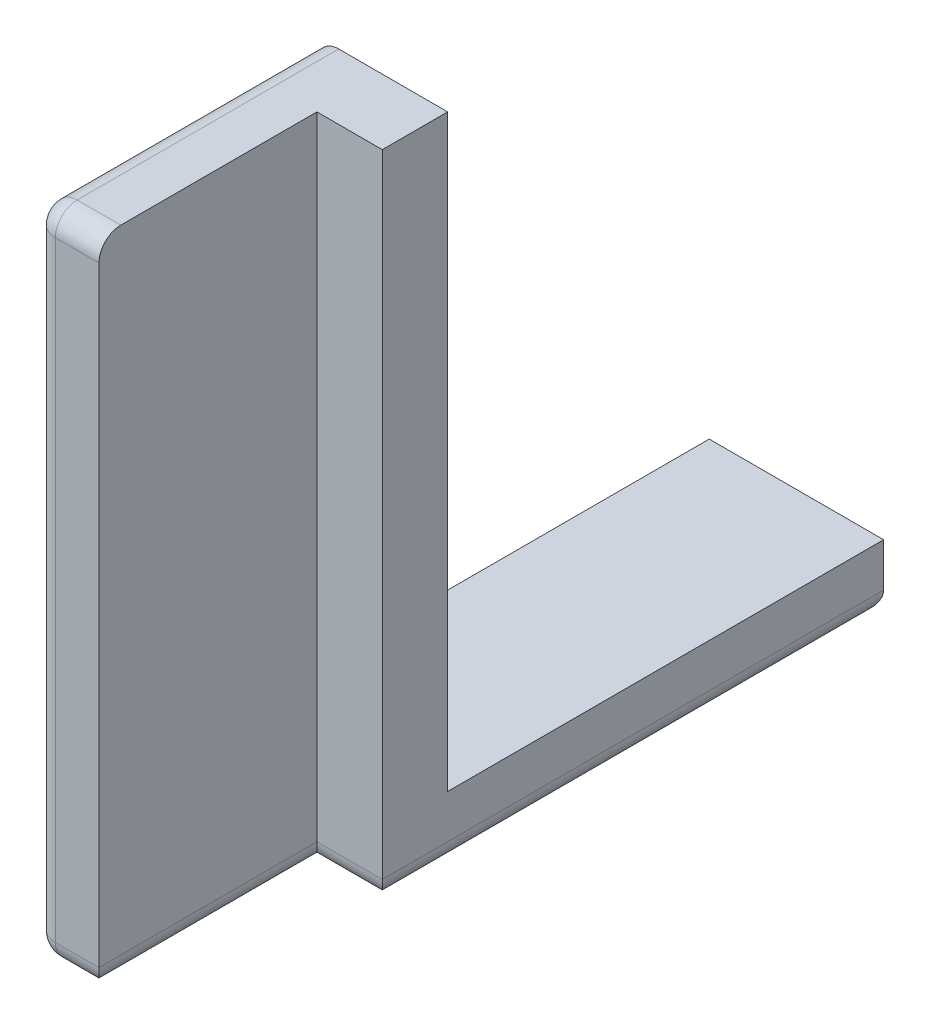
ISO-10303-21;
HEADER;
FILE_DESCRIPTION(('STEP AP214'),'2;1');
FILE_NAME('part.step','',(''),(''),'','','');
FILE_SCHEMA(('AUTOMOTIVE_DESIGN { 1 0 10303 214 1 1 1 1 }'));
ENDSEC;
DATA;
#1=APPLICATION_CONTEXT('core data for automotive mechanical design processes');
#2=APPLICATION_PROTOCOL_DEFINITION('international standard','automotive_design',2000,#1);
#3=PRODUCT_CONTEXT('',#1,'mechanical');
#4=PRODUCT('Part','Part','',(#3));
#5=PRODUCT_RELATED_PRODUCT_CATEGORY('part','',(#4));
#6=PRODUCT_DEFINITION_FORMATION('','',#4);
#7=PRODUCT_DEFINITION_CONTEXT('part definition',#1,'design');
#8=PRODUCT_DEFINITION('design','',#6,#7);
#9=PRODUCT_DEFINITION_SHAPE('','',#8);
#10=(LENGTH_UNIT() NAMED_UNIT(*) SI_UNIT(.MILLI.,.METRE.));
#11=(NAMED_UNIT(*) PLANE_ANGLE_UNIT() SI_UNIT($,.RADIAN.));
#12=(NAMED_UNIT(*) SI_UNIT($,.STERADIAN.) SOLID_ANGLE_UNIT());
#13=UNCERTAINTY_MEASURE_WITH_UNIT(LENGTH_MEASURE(1.E-05),#10,'distance_accuracy_value','');
#14=(GEOMETRIC_REPRESENTATION_CONTEXT(3) GLOBAL_UNCERTAINTY_ASSIGNED_CONTEXT((#13)) GLOBAL_UNIT_ASSIGNED_CONTEXT((#10,
#11,#12)) REPRESENTATION_CONTEXT('',''));
#15=CARTESIAN_POINT('',(0.,0.,0.));
#16=DIRECTION('',(0.,0.,1.));
#17=DIRECTION('',(1.,0.,0.));
#18=AXIS2_PLACEMENT_3D('',#15,#16,#17);
#19=CARTESIAN_POINT('',(0.,0.,0.));
#20=DIRECTION('',(0.,0.,1.));
#21=DIRECTION('',(1.,0.,0.));
#22=AXIS2_PLACEMENT_3D('',#19,#20,#21);
#23=PLANE('',#22);
#24=DIRECTION('',(0.,-1.,0.));
#25=VECTOR('',#24,1.);
#26=CARTESIAN_POINT('',(-3.,0.,0.));
#27=LINE('',#26,#25);
#28=CARTESIAN_POINT('',(-3.,-1.,0.));
#29=VERTEX_POINT('',#28);
#30=CARTESIAN_POINT('',(-3.,-27.,0.));
#31=VERTEX_POINT('',#30);
#32=EDGE_CURVE('E170',#29,#31,#27,.T.);
#33=ORIENTED_EDGE('',*,*,#32,.F.);
#34=CARTESIAN_POINT('',(-2.,-1.,0.));
#35=DIRECTION('',(0.,0.,1.));
#36=DIRECTION('',(1.,0.,0.));
#37=AXIS2_PLACEMENT_3D('',#34,#35,#36);
#38=CIRCLE('',#37,1.);
#39=CARTESIAN_POINT('',(-2.,0.,0.));
#40=VERTEX_POINT('',#39);
#41=EDGE_CURVE('E49',#29,#40,#38,.F.);
#42=ORIENTED_EDGE('',*,*,#41,.T.);
#43=DIRECTION('',(-1.,0.,0.));
#44=VECTOR('',#43,1.);
#45=CARTESIAN_POINT('',(3.,0.,0.));
#46=LINE('',#45,#44);
#47=CARTESIAN_POINT('',(3.,0.,0.));
#48=VERTEX_POINT('',#47);
#49=EDGE_CURVE('E194',#48,#40,#46,.T.);
#50=ORIENTED_EDGE('',*,*,#49,.F.);
#51=DIRECTION('',(0.,1.,0.));
#52=VECTOR('',#51,1.);
#53=CARTESIAN_POINT('',(3.,-30.,0.));
#54=LINE('',#53,#52);
#55=CARTESIAN_POINT('',(3.,-27.,0.));
#56=VERTEX_POINT('',#55);
#57=EDGE_CURVE('E198',#56,#48,#54,.T.);
#58=ORIENTED_EDGE('',*,*,#57,.F.);
#59=DIRECTION('',(1.,0.,0.));
#60=VECTOR('',#59,1.);
#61=CARTESIAN_POINT('',(0.,-27.,0.));
#62=LINE('',#61,#60);
#63=EDGE_CURVE('E380',#31,#56,#62,.T.);
#64=ORIENTED_EDGE('',*,*,#63,.F.);
#65=EDGE_LOOP('',(#33,#42,#50,#58,#64));
#66=FACE_BOUND('',#65,.T.);
#67=ADVANCED_FACE('F39',(#66),#23,.F.);
#68=CARTESIAN_POINT('',(0.,-30.,3.));
#69=DIRECTION('',(0.,1.,0.));
#70=DIRECTION('',(0.,0.,1.));
#71=AXIS2_PLACEMENT_3D('',#68,#69,#70);
#72=PLANE('',#71);
#73=DIRECTION('',(-1.,0.,0.));
#74=VECTOR('',#73,1.);
#75=CARTESIAN_POINT('',(3.,-30.,-19.));
#76=LINE('',#75,#74);
#77=CARTESIAN_POINT('',(-4.,-30.,-19.));
#78=VERTEX_POINT('',#77);
#79=CARTESIAN_POINT('',(2.,-30.,-19.));
#80=VERTEX_POINT('',#79);
#81=EDGE_CURVE('E229',#78,#80,#76,.F.);
#82=ORIENTED_EDGE('',*,*,#81,.T.);
#83=DIRECTION('',(0.,0.,-1.));
#84=VECTOR('',#83,1.);
#85=CARTESIAN_POINT('',(2.,-30.,3.));
#86=LINE('',#85,#84);
#87=CARTESIAN_POINT('',(2.,-30.,2.));
#88=VERTEX_POINT('',#87);
#89=EDGE_CURVE('E232',#80,#88,#86,.F.);
#90=ORIENTED_EDGE('',*,*,#89,.T.);
#91=DIRECTION('',(1.,0.,0.));
#92=VECTOR('',#91,1.);
#93=CARTESIAN_POINT('',(0.,-30.,2.));
#94=LINE('',#93,#92);
#95=CARTESIAN_POINT('',(-1.,-30.,2.));
#96=VERTEX_POINT('',#95);
#97=EDGE_CURVE('E211',#88,#96,#94,.F.);
#98=ORIENTED_EDGE('',*,*,#97,.T.);
#99=DIRECTION('',(0.,0.,-1.));
#100=VECTOR('',#99,1.);
#101=CARTESIAN_POINT('',(-1.,-30.,3.));
#102=LINE('',#101,#100);
#103=CARTESIAN_POINT('',(-1.,-30.,12.));
#104=VERTEX_POINT('',#103);
#105=EDGE_CURVE('E214',#96,#104,#102,.F.);
#106=ORIENTED_EDGE('',*,*,#105,.T.);
#107=DIRECTION('',(1.,0.,0.));
#108=VECTOR('',#107,1.);
#109=CARTESIAN_POINT('',(-3.,-30.,12.));
#110=LINE('',#109,#108);
#111=CARTESIAN_POINT('',(-2.,-30.,12.));
#112=VERTEX_POINT('',#111);
#113=EDGE_CURVE('E217',#104,#112,#110,.F.);
#114=ORIENTED_EDGE('',*,*,#113,.T.);
#115=DIRECTION('',(0.,0.,1.));
#116=VECTOR('',#115,1.);
#117=CARTESIAN_POINT('',(-2.,-30.,0.));
#118=LINE('',#117,#116);
#119=CARTESIAN_POINT('',(-2.,-30.,-1.));
#120=VERTEX_POINT('',#119);
#121=EDGE_CURVE('E220',#112,#120,#118,.F.);
#122=ORIENTED_EDGE('',*,*,#121,.T.);
#123=DIRECTION('',(1.,0.,0.));
#124=VECTOR('',#123,1.);
#125=CARTESIAN_POINT('',(0.,-30.,-1.));
#126=LINE('',#125,#124);
#127=CARTESIAN_POINT('',(-4.,-30.,-1.));
#128=VERTEX_POINT('',#127);
#129=EDGE_CURVE('E223',#120,#128,#126,.F.);
#130=ORIENTED_EDGE('',*,*,#129,.T.);
#131=DIRECTION('',(0.,0.,1.));
#132=VECTOR('',#131,1.);
#133=CARTESIAN_POINT('',(-4.,-30.,3.));
#134=LINE('',#133,#132);
#135=EDGE_CURVE('E226',#128,#78,#134,.F.);
#136=ORIENTED_EDGE('',*,*,#135,.T.);
#137=EDGE_LOOP('',(#82,#90,#98,#106,#114,#122,#130,#136));
#138=FACE_BOUND('',#137,.T.);
#139=ADVANCED_FACE('F420',(#138),#72,.F.);
#140=CARTESIAN_POINT('',(3.,-30.,3.));
#141=DIRECTION('',(-1.,0.,0.));
#142=DIRECTION('',(0.,0.,1.));
#143=AXIS2_PLACEMENT_3D('',#140,#141,#142);
#144=PLANE('',#143);
#145=DIRECTION('',(0.,1.,0.));
#146=VECTOR('',#145,1.);
#147=CARTESIAN_POINT('',(3.,-30.,3.));
#148=LINE('',#147,#146);
#149=CARTESIAN_POINT('',(3.,-29.,3.));
#150=VERTEX_POINT('',#149);
#151=CARTESIAN_POINT('',(3.,0.,3.));
#152=VERTEX_POINT('',#151);
#153=EDGE_CURVE('E185',#150,#152,#148,.T.);
#154=ORIENTED_EDGE('',*,*,#153,.F.);
#155=DIRECTION('',(0.,0.,-1.));
#156=VECTOR('',#155,1.);
#157=CARTESIAN_POINT('',(3.,-29.,3.));
#158=LINE('',#157,#156);
#159=CARTESIAN_POINT('',(3.,-29.,-20.));
#160=VERTEX_POINT('',#159);
#161=EDGE_CURVE('E207',#150,#160,#158,.T.);
#162=ORIENTED_EDGE('',*,*,#161,.T.);
#163=DIRECTION('',(0.,-1.,0.));
#164=VECTOR('',#163,1.);
#165=CARTESIAN_POINT('',(3.,-27.,-20.));
#166=LINE('',#165,#164);
#167=CARTESIAN_POINT('',(3.,-27.,-20.));
#168=VERTEX_POINT('',#167);
#169=EDGE_CURVE('E390',#168,#160,#166,.T.);
#170=ORIENTED_EDGE('',*,*,#169,.F.);
#171=DIRECTION('',(0.,0.,1.));
#172=VECTOR('',#171,1.);
#173=CARTESIAN_POINT('',(3.,-27.,-20.));
#174=LINE('',#173,#172);
#175=EDGE_CURVE('E201',#168,#56,#174,.T.);
#176=ORIENTED_EDGE('',*,*,#175,.T.);
#177=ORIENTED_EDGE('',*,*,#57,.T.);
#178=DIRECTION('',(0.,0.,-1.));
#179=VECTOR('',#178,1.);
#180=CARTESIAN_POINT('',(3.,0.,3.));
#181=LINE('',#180,#179);
#182=EDGE_CURVE('E188',#152,#48,#181,.T.);
#183=ORIENTED_EDGE('',*,*,#182,.F.);
#184=EDGE_LOOP('',(#154,#162,#170,#176,#177,#183));
#185=FACE_BOUND('',#184,.T.);
#186=ADVANCED_FACE('F374',(#185),#144,.F.);
#187=CARTESIAN_POINT('',(3.,0.,3.));
#188=DIRECTION('',(0.,-1.,0.));
#189=DIRECTION('',(1.,0.,0.));
#190=AXIS2_PLACEMENT_3D('',#187,#188,#189);
#191=PLANE('',#190);
#192=DIRECTION('',(0.,0.,-1.));
#193=VECTOR('',#192,1.);
#194=CARTESIAN_POINT('',(-2.,0.,13.));
#195=LINE('',#194,#193);
#196=CARTESIAN_POINT('',(-2.,0.,12.));
#197=VERTEX_POINT('',#196);
#198=EDGE_CURVE('E57',#40,#197,#195,.F.);
#199=ORIENTED_EDGE('',*,*,#198,.T.);
#200=DIRECTION('',(-1.,0.,0.));
#201=VECTOR('',#200,1.);
#202=CARTESIAN_POINT('',(0.,0.,12.));
#203=LINE('',#202,#201);
#204=CARTESIAN_POINT('',(0.,0.,12.));
#205=VERTEX_POINT('',#204);
#206=EDGE_CURVE('E166',#197,#205,#203,.F.);
#207=ORIENTED_EDGE('',*,*,#206,.T.);
#208=DIRECTION('',(0.,0.,-1.));
#209=VECTOR('',#208,1.);
#210=CARTESIAN_POINT('',(0.,0.,13.));
#211=LINE('',#210,#209);
#212=CARTESIAN_POINT('',(0.,0.,3.));
#213=VERTEX_POINT('',#212);
#214=EDGE_CURVE('E160',#205,#213,#211,.T.);
#215=ORIENTED_EDGE('',*,*,#214,.T.);
#216=DIRECTION('',(-1.,0.,0.));
#217=VECTOR('',#216,1.);
#218=CARTESIAN_POINT('',(3.,0.,3.));
#219=LINE('',#218,#217);
#220=EDGE_CURVE('E165',#152,#213,#219,.T.);
#221=ORIENTED_EDGE('',*,*,#220,.F.);
#222=ORIENTED_EDGE('',*,*,#182,.T.);
#223=ORIENTED_EDGE('',*,*,#49,.T.);
#224=EDGE_LOOP('',(#199,#207,#215,#221,#222,#223));
#225=FACE_BOUND('',#224,.T.);
#226=ADVANCED_FACE('F162',(#225),#191,.F.);
#227=CARTESIAN_POINT('',(0.,0.,3.));
#228=DIRECTION('',(0.,0.,1.));
#229=DIRECTION('',(1.,0.,0.));
#230=AXIS2_PLACEMENT_3D('',#227,#228,#229);
#231=PLANE('',#230);
#232=DIRECTION('',(0.,1.,0.));
#233=VECTOR('',#232,1.);
#234=CARTESIAN_POINT('',(0.,-30.,3.));
#235=LINE('',#234,#233);
#236=CARTESIAN_POINT('',(0.,-29.,3.));
#237=VERTEX_POINT('',#236);
#238=EDGE_CURVE('E174',#237,#213,#235,.T.);
#239=ORIENTED_EDGE('',*,*,#238,.F.);
#240=DIRECTION('',(1.,0.,0.));
#241=VECTOR('',#240,1.);
#242=CARTESIAN_POINT('',(3.,-29.,3.));
#243=LINE('',#242,#241);
#244=EDGE_CURVE('E274',#237,#150,#243,.T.);
#245=ORIENTED_EDGE('',*,*,#244,.T.);
#246=ORIENTED_EDGE('',*,*,#153,.T.);
#247=ORIENTED_EDGE('',*,*,#220,.T.);
#248=EDGE_LOOP('',(#239,#245,#246,#247));
#249=FACE_BOUND('',#248,.T.);
#250=ADVANCED_FACE('F183',(#249),#231,.T.);
#251=CARTESIAN_POINT('',(0.,-27.,-20.));
#252=DIRECTION('',(0.,-1.,0.));
#253=DIRECTION('',(0.,0.,-1.));
#254=AXIS2_PLACEMENT_3D('',#251,#252,#253);
#255=PLANE('',#254);
#256=DIRECTION('',(0.,0.,-1.));
#257=VECTOR('',#256,1.);
#258=CARTESIAN_POINT('',(-5.,-27.,-20.));
#259=LINE('',#258,#257);
#260=CARTESIAN_POINT('',(-5.,-27.,-1.));
#261=VERTEX_POINT('',#260);
#262=CARTESIAN_POINT('',(-5.,-27.,-20.));
#263=VERTEX_POINT('',#262);
#264=EDGE_CURVE('E401',#261,#263,#259,.T.);
#265=ORIENTED_EDGE('',*,*,#264,.F.);
#266=CARTESIAN_POINT('',(-4.,-27.,-1.));
#267=DIRECTION('',(0.,-1.,0.));
#268=DIRECTION('',(0.,0.,-1.));
#269=AXIS2_PLACEMENT_3D('',#266,#267,#268);
#270=CIRCLE('',#269,1.);
#271=CARTESIAN_POINT('',(-4.,-27.,0.));
#272=VERTEX_POINT('',#271);
#273=EDGE_CURVE('E11',#261,#272,#270,.F.);
#274=ORIENTED_EDGE('',*,*,#273,.T.);
#275=DIRECTION('',(1.,0.,0.));
#276=VECTOR('',#275,1.);
#277=CARTESIAN_POINT('',(-5.,-27.,0.));
#278=LINE('',#277,#276);
#279=EDGE_CURVE('E388',#272,#31,#278,.T.);
#280=ORIENTED_EDGE('',*,*,#279,.T.);
#281=ORIENTED_EDGE('',*,*,#63,.T.);
#282=ORIENTED_EDGE('',*,*,#175,.F.);
#283=DIRECTION('',(1.,0.,0.));
#284=VECTOR('',#283,1.);
#285=CARTESIAN_POINT('',(0.,-27.,-20.));
#286=LINE('',#285,#284);
#287=EDGE_CURVE('E393',#263,#168,#286,.T.);
#288=ORIENTED_EDGE('',*,*,#287,.F.);
#289=EDGE_LOOP('',(#265,#274,#280,#281,#282,#288));
#290=FACE_BOUND('',#289,.T.);
#291=ADVANCED_FACE('F385',(#290),#255,.F.);
#292=CARTESIAN_POINT('',(0.,0.,-20.));
#293=DIRECTION('',(0.,0.,-1.));
#294=DIRECTION('',(-1.,0.,0.));
#295=AXIS2_PLACEMENT_3D('',#292,#293,#294);
#296=PLANE('',#295);
#297=ORIENTED_EDGE('',*,*,#169,.T.);
#298=DIRECTION('',(-1.,0.,0.));
#299=VECTOR('',#298,1.);
#300=CARTESIAN_POINT('',(-5.,-29.,-20.));
#301=LINE('',#300,#299);
#302=CARTESIAN_POINT('',(-5.,-29.,-20.));
#303=VERTEX_POINT('',#302);
#304=EDGE_CURVE('E236',#160,#303,#301,.T.);
#305=ORIENTED_EDGE('',*,*,#304,.T.);
#306=DIRECTION('',(0.,-1.,0.));
#307=VECTOR('',#306,1.);
#308=CARTESIAN_POINT('',(-5.,-30.,-20.));
#309=LINE('',#308,#307);
#310=EDGE_CURVE('E404',#263,#303,#309,.T.);
#311=ORIENTED_EDGE('',*,*,#310,.F.);
#312=ORIENTED_EDGE('',*,*,#287,.T.);
#313=EDGE_LOOP('',(#297,#305,#311,#312));
#314=FACE_BOUND('',#313,.T.);
#315=ADVANCED_FACE('F627',(#314),#296,.T.);
#316=CARTESIAN_POINT('',(-5.,-27.,0.));
#317=DIRECTION('',(0.,0.,-1.));
#318=DIRECTION('',(-1.,0.,0.));
#319=AXIS2_PLACEMENT_3D('',#316,#317,#318);
#320=PLANE('',#319);
#321=DIRECTION('',(0.,1.,0.));
#322=VECTOR('',#321,1.);
#323=CARTESIAN_POINT('',(-4.,-27.,0.));
#324=LINE('',#323,#322);
#325=CARTESIAN_POINT('',(-4.,-29.,0.));
#326=VERTEX_POINT('',#325);
#327=EDGE_CURVE('E245',#272,#326,#324,.F.);
#328=ORIENTED_EDGE('',*,*,#327,.T.);
#329=DIRECTION('',(1.,0.,0.));
#330=VECTOR('',#329,1.);
#331=CARTESIAN_POINT('',(-5.,-29.,0.));
#332=LINE('',#331,#330);
#333=CARTESIAN_POINT('',(-3.,-29.,0.));
#334=VERTEX_POINT('',#333);
#335=EDGE_CURVE('E248',#326,#334,#332,.T.);
#336=ORIENTED_EDGE('',*,*,#335,.T.);
#337=DIRECTION('',(0.,1.,0.));
#338=VECTOR('',#337,1.);
#339=CARTESIAN_POINT('',(-3.,-27.,0.));
#340=LINE('',#339,#338);
#341=EDGE_CURVE('E192',#334,#31,#340,.T.);
#342=ORIENTED_EDGE('',*,*,#341,.T.);
#343=ORIENTED_EDGE('',*,*,#279,.F.);
#344=EDGE_LOOP('',(#328,#336,#342,#343));
#345=FACE_BOUND('',#344,.T.);
#346=ADVANCED_FACE('F633',(#345),#320,.F.);
#347=CARTESIAN_POINT('',(-5.,0.,0.));
#348=DIRECTION('',(1.,0.,0.));
#349=DIRECTION('',(0.,1.,0.));
#350=AXIS2_PLACEMENT_3D('',#347,#348,#349);
#351=PLANE('',#350);
#352=ORIENTED_EDGE('',*,*,#310,.T.);
#353=DIRECTION('',(0.,0.,1.));
#354=VECTOR('',#353,1.);
#355=CARTESIAN_POINT('',(-5.,-29.,0.));
#356=LINE('',#355,#354);
#357=CARTESIAN_POINT('',(-5.,-29.,-1.));
#358=VERTEX_POINT('',#357);
#359=EDGE_CURVE('E242',#303,#358,#356,.T.);
#360=ORIENTED_EDGE('',*,*,#359,.T.);
#361=DIRECTION('',(0.,1.,0.));
#362=VECTOR('',#361,1.);
#363=CARTESIAN_POINT('',(-5.,0.,-1.));
#364=LINE('',#363,#362);
#365=EDGE_CURVE('E239',#358,#261,#364,.T.);
#366=ORIENTED_EDGE('',*,*,#365,.T.);
#367=ORIENTED_EDGE('',*,*,#264,.T.);
#368=EDGE_LOOP('',(#352,#360,#366,#367));
#369=FACE_BOUND('',#368,.T.);
#370=ADVANCED_FACE('F582',(#369),#351,.F.);
#371=CARTESIAN_POINT('',(-3.,0.,0.));
#372=DIRECTION('',(-1.,0.,0.));
#373=DIRECTION('',(0.,-1.,0.));
#374=AXIS2_PLACEMENT_3D('',#371,#372,#373);
#375=PLANE('',#374);
#376=ORIENTED_EDGE('',*,*,#341,.F.);
#377=DIRECTION('',(0.,0.,1.));
#378=VECTOR('',#377,1.);
#379=CARTESIAN_POINT('',(-3.,-29.,13.));
#380=LINE('',#379,#378);
#381=CARTESIAN_POINT('',(-3.,-29.,12.));
#382=VERTEX_POINT('',#381);
#383=EDGE_CURVE('E257',#334,#382,#380,.T.);
#384=ORIENTED_EDGE('',*,*,#383,.T.);
#385=DIRECTION('',(0.,-1.,0.));
#386=VECTOR('',#385,1.);
#387=CARTESIAN_POINT('',(-3.,0.,12.));
#388=LINE('',#387,#386);
#389=CARTESIAN_POINT('',(-3.,-1.,12.));
#390=VERTEX_POINT('',#389);
#391=EDGE_CURVE('E251',#382,#390,#388,.F.);
#392=ORIENTED_EDGE('',*,*,#391,.T.);
#393=DIRECTION('',(0.,0.,-1.));
#394=VECTOR('',#393,1.);
#395=CARTESIAN_POINT('',(-3.,-1.,0.));
#396=LINE('',#395,#394);
#397=EDGE_CURVE('E254',#390,#29,#396,.T.);
#398=ORIENTED_EDGE('',*,*,#397,.T.);
#399=ORIENTED_EDGE('',*,*,#32,.T.);
#400=EDGE_LOOP('',(#376,#384,#392,#398,#399));
#401=FACE_BOUND('',#400,.T.);
#402=ADVANCED_FACE('F411',(#401),#375,.T.);
#403=CARTESIAN_POINT('',(0.,-30.,13.));
#404=DIRECTION('',(-1.,0.,0.));
#405=DIRECTION('',(0.,0.,1.));
#406=AXIS2_PLACEMENT_3D('',#403,#404,#405);
#407=PLANE('',#406);
#408=DIRECTION('',(0.,1.,0.));
#409=VECTOR('',#408,1.);
#410=CARTESIAN_POINT('',(0.,-30.,13.));
#411=LINE('',#410,#409);
#412=CARTESIAN_POINT('',(0.,-29.,13.));
#413=VERTEX_POINT('',#412);
#414=CARTESIAN_POINT('',(0.,-1.,13.));
#415=VERTEX_POINT('',#414);
#416=EDGE_CURVE('E171',#413,#415,#411,.T.);
#417=ORIENTED_EDGE('',*,*,#416,.F.);
#418=DIRECTION('',(0.,0.,-1.));
#419=VECTOR('',#418,1.);
#420=CARTESIAN_POINT('',(0.,-29.,13.));
#421=LINE('',#420,#419);
#422=EDGE_CURVE('E178',#413,#237,#421,.T.);
#423=ORIENTED_EDGE('',*,*,#422,.T.);
#424=ORIENTED_EDGE('',*,*,#238,.T.);
#425=ORIENTED_EDGE('',*,*,#214,.F.);
#426=CARTESIAN_POINT('',(0.,-1.,12.));
#427=DIRECTION('',(-1.,0.,0.));
#428=DIRECTION('',(0.,0.,1.));
#429=AXIS2_PLACEMENT_3D('',#426,#427,#428);
#430=CIRCLE('',#429,1.);
#431=EDGE_CURVE('E269',#205,#415,#430,.F.);
#432=ORIENTED_EDGE('',*,*,#431,.T.);
#433=EDGE_LOOP('',(#417,#423,#424,#425,#432));
#434=FACE_BOUND('',#433,.T.);
#435=ADVANCED_FACE('F176',(#434),#407,.F.);
#436=CARTESIAN_POINT('',(0.,0.,13.));
#437=DIRECTION('',(0.,0.,1.));
#438=DIRECTION('',(1.,0.,0.));
#439=AXIS2_PLACEMENT_3D('',#436,#437,#438);
#440=PLANE('',#439);
#441=DIRECTION('',(0.,-1.,0.));
#442=VECTOR('',#441,1.);
#443=CARTESIAN_POINT('',(-2.,0.,13.));
#444=LINE('',#443,#442);
#445=CARTESIAN_POINT('',(-2.,-1.,13.));
#446=VERTEX_POINT('',#445);
#447=CARTESIAN_POINT('',(-2.,-29.,13.));
#448=VERTEX_POINT('',#447);
#449=EDGE_CURVE('E260',#446,#448,#444,.T.);
#450=ORIENTED_EDGE('',*,*,#449,.T.);
#451=DIRECTION('',(1.,0.,0.));
#452=VECTOR('',#451,1.);
#453=CARTESIAN_POINT('',(0.,-29.,13.));
#454=LINE('',#453,#452);
#455=EDGE_CURVE('E266',#448,#413,#454,.T.);
#456=ORIENTED_EDGE('',*,*,#455,.T.);
#457=ORIENTED_EDGE('',*,*,#416,.T.);
#458=DIRECTION('',(-1.,0.,0.));
#459=VECTOR('',#458,1.);
#460=CARTESIAN_POINT('',(-3.,-1.,13.));
#461=LINE('',#460,#459);
#462=EDGE_CURVE('E263',#415,#446,#461,.T.);
#463=ORIENTED_EDGE('',*,*,#462,.T.);
#464=EDGE_LOOP('',(#450,#456,#457,#463));
#465=FACE_BOUND('',#464,.T.);
#466=ADVANCED_FACE('F352',(#465),#440,.T.);
#467=CARTESIAN_POINT('',(-2.,-1.,0.));
#468=DIRECTION('',(0.,0.,1.));
#469=DIRECTION('',(1.,0.,0.));
#470=AXIS2_PLACEMENT_3D('',#467,#468,#469);
#471=CYLINDRICAL_SURFACE('',#470,1.);
#472=ORIENTED_EDGE('',*,*,#41,.F.);
#473=ORIENTED_EDGE('',*,*,#397,.F.);
#474=CARTESIAN_POINT('',(-2.,-1.,12.));
#475=DIRECTION('',(0.,0.,1.));
#476=DIRECTION('',(1.,0.,0.));
#477=AXIS2_PLACEMENT_3D('',#474,#475,#476);
#478=CIRCLE('',#477,1.);
#479=EDGE_CURVE('E43',#197,#390,#478,.T.);
#480=ORIENTED_EDGE('',*,*,#479,.F.);
#481=ORIENTED_EDGE('',*,*,#198,.F.);
#482=EDGE_LOOP('',(#472,#473,#480,#481));
#483=FACE_BOUND('',#482,.T.);
#484=ADVANCED_FACE('F41',(#483),#471,.T.);
#485=CARTESIAN_POINT('',(0.,-1.,12.));
#486=DIRECTION('',(1.,0.,0.));
#487=DIRECTION('',(0.,1.,0.));
#488=AXIS2_PLACEMENT_3D('',#485,#486,#487);
#489=CYLINDRICAL_SURFACE('',#488,1.);
#490=ORIENTED_EDGE('',*,*,#431,.F.);
#491=ORIENTED_EDGE('',*,*,#206,.F.);
#492=CARTESIAN_POINT('',(-2.,-1.,12.));
#493=DIRECTION('',(-1.,0.,0.));
#494=DIRECTION('',(0.,0.,1.));
#495=AXIS2_PLACEMENT_3D('',#492,#493,#494);
#496=CIRCLE('',#495,1.);
#497=EDGE_CURVE('E332',#446,#197,#496,.T.);
#498=ORIENTED_EDGE('',*,*,#497,.F.);
#499=ORIENTED_EDGE('',*,*,#462,.F.);
#500=EDGE_LOOP('',(#490,#491,#498,#499));
#501=FACE_BOUND('',#500,.T.);
#502=ADVANCED_FACE('F357',(#501),#489,.T.);
#503=CARTESIAN_POINT('',(-2.,-1.,12.));
#504=DIRECTION('',(0.,0.,1.));
#505=DIRECTION('',(1.,0.,0.));
#506=AXIS2_PLACEMENT_3D('',#503,#504,#505);
#507=SPHERICAL_SURFACE('',#506,1.);
#508=ORIENTED_EDGE('',*,*,#497,.T.);
#509=ORIENTED_EDGE('',*,*,#479,.T.);
#510=CARTESIAN_POINT('',(-2.,-1.,12.));
#511=DIRECTION('',(0.,1.,0.));
#512=DIRECTION('',(-1.,0.,0.));
#513=AXIS2_PLACEMENT_3D('',#510,#511,#512);
#514=CIRCLE('',#513,1.);
#515=EDGE_CURVE('E329',#446,#390,#514,.F.);
#516=ORIENTED_EDGE('',*,*,#515,.F.);
#517=EDGE_LOOP('',(#508,#509,#516));
#518=FACE_BOUND('',#517,.T.);
#519=ADVANCED_FACE('F341',(#518),#507,.T.);
#520=CARTESIAN_POINT('',(-2.,0.,12.));
#521=DIRECTION('',(0.,-1.,0.));
#522=DIRECTION('',(1.,0.,0.));
#523=AXIS2_PLACEMENT_3D('',#520,#521,#522);
#524=CYLINDRICAL_SURFACE('',#523,1.);
#525=ORIENTED_EDGE('',*,*,#515,.T.);
#526=ORIENTED_EDGE('',*,*,#391,.F.);
#527=CARTESIAN_POINT('',(-2.,-29.,12.));
#528=DIRECTION('',(0.,-1.,0.));
#529=DIRECTION('',(0.,0.,-1.));
#530=AXIS2_PLACEMENT_3D('',#527,#528,#529);
#531=CIRCLE('',#530,1.);
#532=EDGE_CURVE('E321',#448,#382,#531,.T.);
#533=ORIENTED_EDGE('',*,*,#532,.F.);
#534=ORIENTED_EDGE('',*,*,#449,.F.);
#535=EDGE_LOOP('',(#525,#526,#533,#534));
#536=FACE_BOUND('',#535,.T.);
#537=ADVANCED_FACE('F347',(#536),#524,.T.);
#538=CARTESIAN_POINT('',(-2.,-29.,0.));
#539=DIRECTION('',(0.,0.,-1.));
#540=DIRECTION('',(-1.,0.,0.));
#541=AXIS2_PLACEMENT_3D('',#538,#539,#540);
#542=CYLINDRICAL_SURFACE('',#541,1.);
#543=CARTESIAN_POINT('',(-2.,-29.,12.));
#544=DIRECTION('',(0.,0.,1.));
#545=DIRECTION('',(1.,0.,0.));
#546=AXIS2_PLACEMENT_3D('',#543,#544,#545);
#547=CIRCLE('',#546,1.);
#548=EDGE_CURVE('E325',#382,#112,#547,.T.);
#549=ORIENTED_EDGE('',*,*,#548,.F.);
#550=ORIENTED_EDGE('',*,*,#383,.F.);
#551=CARTESIAN_POINT('',(-2.,-29.,-1.));
#552=DIRECTION('',(0.707106781186547,0.,0.707106781186547));
#553=DIRECTION('',(0.707106781186547,0.,-0.707106781186547));
#554=AXIS2_PLACEMENT_3D('',#551,#552,#553);
#555=ELLIPSE('',#554,1.41421356237309,1.);
#556=EDGE_CURVE('E317',#120,#334,#555,.F.);
#557=ORIENTED_EDGE('',*,*,#556,.F.);
#558=ORIENTED_EDGE('',*,*,#121,.F.);
#559=EDGE_LOOP('',(#549,#550,#557,#558));
#560=FACE_BOUND('',#559,.T.);
#561=ADVANCED_FACE('F467',(#560),#542,.T.);
#562=CARTESIAN_POINT('',(-2.,-29.,12.));
#563=DIRECTION('',(0.,0.,1.));
#564=DIRECTION('',(1.,0.,0.));
#565=AXIS2_PLACEMENT_3D('',#562,#563,#564);
#566=SPHERICAL_SURFACE('',#565,1.);
#567=ORIENTED_EDGE('',*,*,#532,.T.);
#568=ORIENTED_EDGE('',*,*,#548,.T.);
#569=CARTESIAN_POINT('',(-2.,-29.,12.));
#570=DIRECTION('',(-1.,0.,0.));
#571=DIRECTION('',(0.,0.,1.));
#572=AXIS2_PLACEMENT_3D('',#569,#570,#571);
#573=CIRCLE('',#572,1.);
#574=EDGE_CURVE('E313',#448,#112,#573,.F.);
#575=ORIENTED_EDGE('',*,*,#574,.F.);
#576=EDGE_LOOP('',(#567,#568,#575));
#577=FACE_BOUND('',#576,.T.);
#578=ADVANCED_FACE('F463',(#577),#566,.T.);
#579=CARTESIAN_POINT('',(-4.,0.,-1.));
#580=DIRECTION('',(0.,1.,0.));
#581=DIRECTION('',(-1.,0.,0.));
#582=AXIS2_PLACEMENT_3D('',#579,#580,#581);
#583=CYLINDRICAL_SURFACE('',#582,1.);
#584=ORIENTED_EDGE('',*,*,#273,.F.);
#585=ORIENTED_EDGE('',*,*,#365,.F.);
#586=CARTESIAN_POINT('',(-4.,-29.,-1.));
#587=DIRECTION('',(0.,-1.,0.));
#588=DIRECTION('',(0.,0.,-1.));
#589=AXIS2_PLACEMENT_3D('',#586,#587,#588);
#590=CIRCLE('',#589,1.);
#591=EDGE_CURVE('E309',#326,#358,#590,.T.);
#592=ORIENTED_EDGE('',*,*,#591,.F.);
#593=ORIENTED_EDGE('',*,*,#327,.F.);
#594=EDGE_LOOP('',(#584,#585,#592,#593));
#595=FACE_BOUND('',#594,.T.);
#596=ADVANCED_FACE('F459',(#595),#583,.T.);
#597=CARTESIAN_POINT('',(-5.,-29.,-1.));
#598=DIRECTION('',(1.,0.,0.));
#599=DIRECTION('',(0.,0.,-1.));
#600=AXIS2_PLACEMENT_3D('',#597,#598,#599);
#601=CYLINDRICAL_SURFACE('',#600,1.);
#602=ORIENTED_EDGE('',*,*,#556,.T.);
#603=ORIENTED_EDGE('',*,*,#335,.F.);
#604=CARTESIAN_POINT('',(-4.,-29.,-1.));
#605=DIRECTION('',(-1.,0.,0.));
#606=DIRECTION('',(0.,0.,1.));
#607=AXIS2_PLACEMENT_3D('',#604,#605,#606);
#608=CIRCLE('',#607,1.);
#609=EDGE_CURVE('E305',#128,#326,#608,.T.);
#610=ORIENTED_EDGE('',*,*,#609,.F.);
#611=ORIENTED_EDGE('',*,*,#129,.F.);
#612=EDGE_LOOP('',(#602,#603,#610,#611));
#613=FACE_BOUND('',#612,.T.);
#614=ADVANCED_FACE('F456',(#613),#601,.T.);
#615=CARTESIAN_POINT('',(0.,-29.,12.));
#616=DIRECTION('',(-1.,0.,0.));
#617=DIRECTION('',(0.,0.,1.));
#618=AXIS2_PLACEMENT_3D('',#615,#616,#617);
#619=CYLINDRICAL_SURFACE('',#618,1.);
#620=ORIENTED_EDGE('',*,*,#574,.T.);
#621=ORIENTED_EDGE('',*,*,#113,.F.);
#622=CARTESIAN_POINT('',(-1.,-29.,12.));
#623=DIRECTION('',(0.707106781186547,0.,-0.707106781186547));
#624=DIRECTION('',(-0.707106781186547,0.,-0.707106781186547));
#625=AXIS2_PLACEMENT_3D('',#622,#623,#624);
#626=ELLIPSE('',#625,1.41421356237309,1.);
#627=EDGE_CURVE('E301',#413,#104,#626,.T.);
#628=ORIENTED_EDGE('',*,*,#627,.F.);
#629=ORIENTED_EDGE('',*,*,#455,.F.);
#630=EDGE_LOOP('',(#620,#621,#628,#629));
#631=FACE_BOUND('',#630,.T.);
#632=ADVANCED_FACE('F363',(#631),#619,.T.);
#633=CARTESIAN_POINT('',(-4.,-29.,-1.));
#634=DIRECTION('',(0.,0.,1.));
#635=DIRECTION('',(1.,0.,0.));
#636=AXIS2_PLACEMENT_3D('',#633,#634,#635);
#637=SPHERICAL_SURFACE('',#636,1.);
#638=ORIENTED_EDGE('',*,*,#609,.T.);
#639=ORIENTED_EDGE('',*,*,#591,.T.);
#640=CARTESIAN_POINT('',(-4.,-29.,-1.));
#641=DIRECTION('',(0.,0.,1.));
#642=DIRECTION('',(1.,0.,0.));
#643=AXIS2_PLACEMENT_3D('',#640,#641,#642);
#644=CIRCLE('',#643,1.);
#645=EDGE_CURVE('E297',#128,#358,#644,.F.);
#646=ORIENTED_EDGE('',*,*,#645,.F.);
#647=EDGE_LOOP('',(#638,#639,#646));
#648=FACE_BOUND('',#647,.T.);
#649=ADVANCED_FACE('F450',(#648),#637,.T.);
#650=CARTESIAN_POINT('',(-1.,-29.,13.));
#651=DIRECTION('',(0.,0.,-1.));
#652=DIRECTION('',(-1.,0.,0.));
#653=AXIS2_PLACEMENT_3D('',#650,#651,#652);
#654=CYLINDRICAL_SURFACE('',#653,1.);
#655=ORIENTED_EDGE('',*,*,#627,.T.);
#656=ORIENTED_EDGE('',*,*,#105,.F.);
#657=CARTESIAN_POINT('',(-1.,-29.,2.));
#658=DIRECTION('',(0.707106781186547,0.,-0.707106781186547));
#659=DIRECTION('',(-0.707106781186547,0.,-0.707106781186547));
#660=AXIS2_PLACEMENT_3D('',#657,#658,#659);
#661=ELLIPSE('',#660,1.41421356237309,1.);
#662=EDGE_CURVE('E293',#237,#96,#661,.T.);
#663=ORIENTED_EDGE('',*,*,#662,.F.);
#664=ORIENTED_EDGE('',*,*,#422,.F.);
#665=EDGE_LOOP('',(#655,#656,#663,#664));
#666=FACE_BOUND('',#665,.T.);
#667=ADVANCED_FACE('F366',(#666),#654,.T.);
#668=CARTESIAN_POINT('',(-4.,-29.,0.));
#669=DIRECTION('',(0.,0.,1.));
#670=DIRECTION('',(1.,0.,0.));
#671=AXIS2_PLACEMENT_3D('',#668,#669,#670);
#672=CYLINDRICAL_SURFACE('',#671,1.);
#673=ORIENTED_EDGE('',*,*,#645,.T.);
#674=ORIENTED_EDGE('',*,*,#359,.F.);
#675=CARTESIAN_POINT('',(-4.,-29.,-19.));
#676=DIRECTION('',(-0.707106781186547,0.,0.707106781186547));
#677=DIRECTION('',(0.707106781186547,0.,0.707106781186547));
#678=AXIS2_PLACEMENT_3D('',#675,#676,#677);
#679=ELLIPSE('',#678,1.41421356237309,1.);
#680=EDGE_CURVE('E289',#78,#303,#679,.F.);
#681=ORIENTED_EDGE('',*,*,#680,.F.);
#682=ORIENTED_EDGE('',*,*,#135,.F.);
#683=EDGE_LOOP('',(#673,#674,#681,#682));
#684=FACE_BOUND('',#683,.T.);
#685=ADVANCED_FACE('F444',(#684),#672,.T.);
#686=CARTESIAN_POINT('',(0.,-29.,2.));
#687=DIRECTION('',(-1.,0.,0.));
#688=DIRECTION('',(0.,0.,1.));
#689=AXIS2_PLACEMENT_3D('',#686,#687,#688);
#690=CYLINDRICAL_SURFACE('',#689,1.);
#691=ORIENTED_EDGE('',*,*,#662,.T.);
#692=ORIENTED_EDGE('',*,*,#97,.F.);
#693=CARTESIAN_POINT('',(2.,-29.,2.));
#694=DIRECTION('',(-0.707106781186547,0.,0.707106781186547));
#695=DIRECTION('',(-0.707106781186547,0.,-0.707106781186547));
#696=AXIS2_PLACEMENT_3D('',#693,#694,#695);
#697=ELLIPSE('',#696,1.41421356237309,1.);
#698=EDGE_CURVE('E286',#150,#88,#697,.F.);
#699=ORIENTED_EDGE('',*,*,#698,.F.);
#700=ORIENTED_EDGE('',*,*,#244,.F.);
#701=EDGE_LOOP('',(#691,#692,#699,#700));
#702=FACE_BOUND('',#701,.T.);
#703=ADVANCED_FACE('F371',(#702),#690,.T.);
#704=CARTESIAN_POINT('',(0.,-29.,-19.));
#705=DIRECTION('',(1.,0.,0.));
#706=DIRECTION('',(0.,0.,-1.));
#707=AXIS2_PLACEMENT_3D('',#704,#705,#706);
#708=CYLINDRICAL_SURFACE('',#707,1.);
#709=ORIENTED_EDGE('',*,*,#680,.T.);
#710=ORIENTED_EDGE('',*,*,#304,.F.);
#711=CARTESIAN_POINT('',(2.,-29.,-19.));
#712=DIRECTION('',(0.707106781186547,0.,0.707106781186547));
#713=DIRECTION('',(0.707106781186547,0.,-0.707106781186547));
#714=AXIS2_PLACEMENT_3D('',#711,#712,#713);
#715=ELLIPSE('',#714,1.41421356237309,1.);
#716=EDGE_CURVE('E283',#80,#160,#715,.T.);
#717=ORIENTED_EDGE('',*,*,#716,.F.);
#718=ORIENTED_EDGE('',*,*,#81,.F.);
#719=EDGE_LOOP('',(#709,#710,#717,#718));
#720=FACE_BOUND('',#719,.T.);
#721=ADVANCED_FACE('F437',(#720),#708,.T.);
#722=CARTESIAN_POINT('',(2.,-29.,3.));
#723=DIRECTION('',(0.,0.,-1.));
#724=DIRECTION('',(-1.,0.,0.));
#725=AXIS2_PLACEMENT_3D('',#722,#723,#724);
#726=CYLINDRICAL_SURFACE('',#725,1.);
#727=ORIENTED_EDGE('',*,*,#698,.T.);
#728=ORIENTED_EDGE('',*,*,#89,.F.);
#729=ORIENTED_EDGE('',*,*,#716,.T.);
#730=ORIENTED_EDGE('',*,*,#161,.F.);
#731=EDGE_LOOP('',(#727,#728,#729,#730));
#732=FACE_BOUND('',#731,.T.);
#733=ADVANCED_FACE('F434',(#732),#726,.T.);
#734=CLOSED_SHELL('',(#67,#139,#186,#226,#250,#291,#315,#346,#370,#402,#435,#466,#484,#502,#519,
#537,#561,#578,#596,#614,#632,#649,#667,#685,#703,#721,#733));
#735=MANIFOLD_SOLID_BREP('B2',#734);
#736=ADVANCED_BREP_SHAPE_REPRESENTATION('',(#18,#735),#14);
#737=SHAPE_DEFINITION_REPRESENTATION(#9,#736);
ENDSEC;
END-ISO-10303-21;
